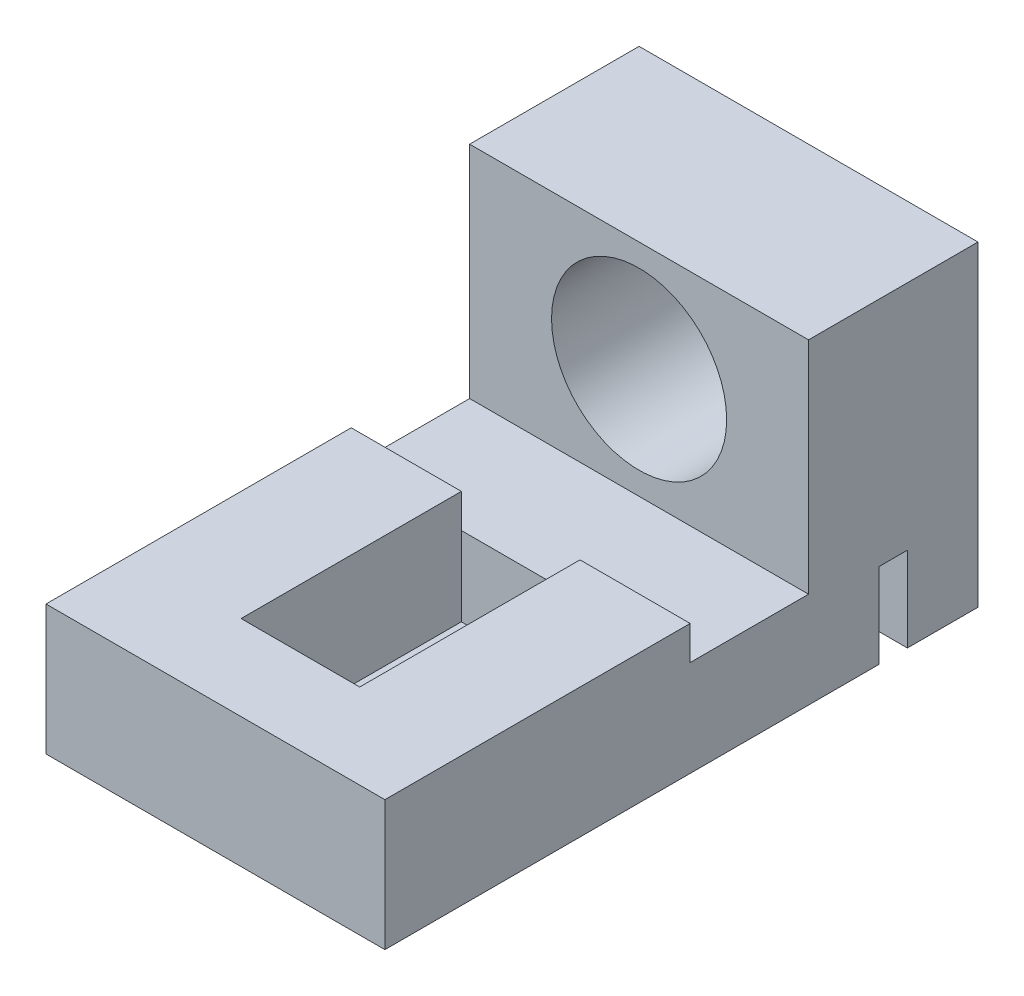
ISO-10303-21;
HEADER;
FILE_DESCRIPTION(('STEP AP214'),'2;1');
FILE_NAME('part.step','',(''),(''),'','','');
FILE_SCHEMA(('AUTOMOTIVE_DESIGN { 1 0 10303 214 1 1 1 1 }'));
ENDSEC;
DATA;
#1=APPLICATION_CONTEXT('core data for automotive mechanical design processes');
#2=APPLICATION_PROTOCOL_DEFINITION('international standard','automotive_design',2000,#1);
#3=PRODUCT_CONTEXT('',#1,'mechanical');
#4=PRODUCT('Part','Part','',(#3));
#5=PRODUCT_RELATED_PRODUCT_CATEGORY('part','',(#4));
#6=PRODUCT_DEFINITION_FORMATION('','',#4);
#7=PRODUCT_DEFINITION_CONTEXT('part definition',#1,'design');
#8=PRODUCT_DEFINITION('design','',#6,#7);
#9=PRODUCT_DEFINITION_SHAPE('','',#8);
#10=(LENGTH_UNIT() NAMED_UNIT(*) SI_UNIT(.MILLI.,.METRE.));
#11=(NAMED_UNIT(*) PLANE_ANGLE_UNIT() SI_UNIT($,.RADIAN.));
#12=(NAMED_UNIT(*) SI_UNIT($,.STERADIAN.) SOLID_ANGLE_UNIT());
#13=UNCERTAINTY_MEASURE_WITH_UNIT(LENGTH_MEASURE(1.E-05),#10,'distance_accuracy_value','');
#14=(GEOMETRIC_REPRESENTATION_CONTEXT(3) GLOBAL_UNCERTAINTY_ASSIGNED_CONTEXT((#13)) GLOBAL_UNIT_ASSIGNED_CONTEXT((#10,
#11,#12)) REPRESENTATION_CONTEXT('',''));
#15=CARTESIAN_POINT('',(0.,0.,0.));
#16=DIRECTION('',(0.,0.,1.));
#17=DIRECTION('',(1.,0.,0.));
#18=AXIS2_PLACEMENT_3D('',#15,#16,#17);
#19=CARTESIAN_POINT('',(60.,0.,0.));
#20=DIRECTION('',(1.,0.,0.));
#21=DIRECTION('',(0.,0.,-1.));
#22=AXIS2_PLACEMENT_3D('',#19,#20,#21);
#23=PLANE('',#22);
#24=DIRECTION('',(0.,1.,0.));
#25=VECTOR('',#24,1.);
#26=CARTESIAN_POINT('',(60.,4.545603587232,15.));
#27=LINE('',#26,#25);
#28=CARTESIAN_POINT('',(60.,-34.454396412768,15.));
#29=VERTEX_POINT('',#28);
#30=CARTESIAN_POINT('',(60.,4.545603587232,15.));
#31=VERTEX_POINT('',#30);
#32=EDGE_CURVE('E217',#29,#31,#27,.T.);
#33=ORIENTED_EDGE('',*,*,#32,.F.);
#34=DIRECTION('',(0.,0.,1.));
#35=VECTOR('',#34,1.);
#36=CARTESIAN_POINT('',(60.,-34.454396412768,4.57508133052897));
#37=LINE('',#36,#35);
#38=CARTESIAN_POINT('',(60.,-34.454396412768,35.9642857142857));
#39=VERTEX_POINT('',#38);
#40=EDGE_CURVE('E249',#29,#39,#37,.T.);
#41=ORIENTED_EDGE('',*,*,#40,.T.);
#42=DIRECTION('',(0.,-1.,0.));
#43=VECTOR('',#42,1.);
#44=CARTESIAN_POINT('',(60.,-28.454396412768,35.9642857142857));
#45=LINE('',#44,#43);
#46=CARTESIAN_POINT('',(60.,-28.454396412768,35.9642857142857));
#47=VERTEX_POINT('',#46);
#48=EDGE_CURVE('E181',#47,#39,#45,.T.);
#49=ORIENTED_EDGE('',*,*,#48,.F.);
#50=DIRECTION('',(0.,0.,1.));
#51=VECTOR('',#50,1.);
#52=CARTESIAN_POINT('',(60.,-28.454396412768,0.));
#53=LINE('',#52,#51);
#54=CARTESIAN_POINT('',(60.,-28.454396412768,90.));
#55=VERTEX_POINT('',#54);
#56=EDGE_CURVE('E173',#47,#55,#53,.T.);
#57=ORIENTED_EDGE('',*,*,#56,.T.);
#58=DIRECTION('',(0.,-1.,0.));
#59=VECTOR('',#58,1.);
#60=CARTESIAN_POINT('',(60.,-34.454396412768,90.));
#61=LINE('',#60,#59);
#62=CARTESIAN_POINT('',(60.,-51.454396412768,90.));
#63=VERTEX_POINT('',#62);
#64=EDGE_CURVE('E157',#55,#63,#61,.T.);
#65=ORIENTED_EDGE('',*,*,#64,.T.);
#66=DIRECTION('',(0.,0.,-1.));
#67=VECTOR('',#66,1.);
#68=CARTESIAN_POINT('',(60.,-51.454396412768,25.));
#69=LINE('',#68,#67);
#70=CARTESIAN_POINT('',(60.,-51.454396412768,2.5));
#71=VERTEX_POINT('',#70);
#72=EDGE_CURVE('E278',#63,#71,#69,.T.);
#73=ORIENTED_EDGE('',*,*,#72,.T.);
#74=DIRECTION('',(0.,-1.,0.));
#75=VECTOR('',#74,1.);
#76=CARTESIAN_POINT('',(60.,-66.454396412768,2.5));
#77=LINE('',#76,#75);
#78=CARTESIAN_POINT('',(60.,-36.454396412768,2.5));
#79=VERTEX_POINT('',#78);
#80=EDGE_CURVE('E255',#79,#71,#77,.T.);
#81=ORIENTED_EDGE('',*,*,#80,.F.);
#82=DIRECTION('',(0.,0.,1.));
#83=VECTOR('',#82,1.);
#84=CARTESIAN_POINT('',(60.,-36.454396412768,-2.5));
#85=LINE('',#84,#83);
#86=CARTESIAN_POINT('',(60.,-36.454396412768,-2.5));
#87=VERTEX_POINT('',#86);
#88=EDGE_CURVE('E261',#87,#79,#85,.T.);
#89=ORIENTED_EDGE('',*,*,#88,.F.);
#90=DIRECTION('',(0.,1.,0.));
#91=VECTOR('',#90,1.);
#92=CARTESIAN_POINT('',(60.,-66.454396412768,-2.5));
#93=LINE('',#92,#91);
#94=CARTESIAN_POINT('',(60.,-51.454396412768,-2.5));
#95=VERTEX_POINT('',#94);
#96=EDGE_CURVE('E258',#95,#87,#93,.T.);
#97=ORIENTED_EDGE('',*,*,#96,.F.);
#98=CARTESIAN_POINT('',(60.,-51.454396412768,-15.));
#99=VERTEX_POINT('',#98);
#100=EDGE_CURVE('E281',#95,#99,#69,.T.);
#101=ORIENTED_EDGE('',*,*,#100,.T.);
#102=DIRECTION('',(0.,1.,0.));
#103=VECTOR('',#102,1.);
#104=CARTESIAN_POINT('',(60.,4.545603587232,-15.));
#105=LINE('',#104,#103);
#106=CARTESIAN_POINT('',(60.,4.545603587232,-15.));
#107=VERTEX_POINT('',#106);
#108=EDGE_CURVE('E225',#99,#107,#105,.T.);
#109=ORIENTED_EDGE('',*,*,#108,.T.);
#110=DIRECTION('',(0.,0.,1.));
#111=VECTOR('',#110,1.);
#112=CARTESIAN_POINT('',(60.,4.545603587232,15.));
#113=LINE('',#112,#111);
#114=EDGE_CURVE('E280',#107,#31,#113,.T.);
#115=ORIENTED_EDGE('',*,*,#114,.T.);
#116=EDGE_LOOP('',(#33,#41,#49,#57,#65,#73,#81,#89,#97,#101,#109,#115));
#117=FACE_BOUND('',#116,.T.);
#118=ADVANCED_FACE('F35',(#117),#23,.T.);
#119=CARTESIAN_POINT('',(0.,0.,0.));
#120=DIRECTION('',(1.,0.,0.));
#121=DIRECTION('',(0.,0.,-1.));
#122=AXIS2_PLACEMENT_3D('',#119,#120,#121);
#123=PLANE('',#122);
#124=DIRECTION('',(0.,-1.,0.));
#125=VECTOR('',#124,1.);
#126=CARTESIAN_POINT('',(0.,-34.454396412768,90.));
#127=LINE('',#126,#125);
#128=CARTESIAN_POINT('',(0.,-28.454396412768,90.));
#129=VERTEX_POINT('',#128);
#130=CARTESIAN_POINT('',(0.,-51.454396412768,90.));
#131=VERTEX_POINT('',#130);
#132=EDGE_CURVE('E166',#129,#131,#127,.T.);
#133=ORIENTED_EDGE('',*,*,#132,.F.);
#134=DIRECTION('',(0.,0.,-1.));
#135=VECTOR('',#134,1.);
#136=CARTESIAN_POINT('',(0.,-28.454396412768,0.));
#137=LINE('',#136,#135);
#138=CARTESIAN_POINT('',(0.,-28.454396412768,35.9642857142857));
#139=VERTEX_POINT('',#138);
#140=EDGE_CURVE('E177',#129,#139,#137,.T.);
#141=ORIENTED_EDGE('',*,*,#140,.T.);
#142=DIRECTION('',(0.,-1.,0.));
#143=VECTOR('',#142,1.);
#144=CARTESIAN_POINT('',(0.,-28.454396412768,35.9642857142857));
#145=LINE('',#144,#143);
#146=CARTESIAN_POINT('',(0.,-34.454396412768,35.9642857142857));
#147=VERTEX_POINT('',#146);
#148=EDGE_CURVE('E201',#139,#147,#145,.T.);
#149=ORIENTED_EDGE('',*,*,#148,.T.);
#150=DIRECTION('',(0.,0.,-1.));
#151=VECTOR('',#150,1.);
#152=CARTESIAN_POINT('',(0.,-34.454396412768,4.57508133052897));
#153=LINE('',#152,#151);
#154=CARTESIAN_POINT('',(0.,-34.454396412768,15.));
#155=VERTEX_POINT('',#154);
#156=EDGE_CURVE('E52',#147,#155,#153,.T.);
#157=ORIENTED_EDGE('',*,*,#156,.T.);
#158=DIRECTION('',(0.,-1.,0.));
#159=VECTOR('',#158,1.);
#160=CARTESIAN_POINT('',(0.,4.545603587232,15.));
#161=LINE('',#160,#159);
#162=CARTESIAN_POINT('',(0.,4.545603587232,15.));
#163=VERTEX_POINT('',#162);
#164=EDGE_CURVE('E204',#163,#155,#161,.T.);
#165=ORIENTED_EDGE('',*,*,#164,.F.);
#166=DIRECTION('',(0.,0.,1.));
#167=VECTOR('',#166,1.);
#168=CARTESIAN_POINT('',(0.,4.545603587232,15.));
#169=LINE('',#168,#167);
#170=CARTESIAN_POINT('',(0.,4.54560358723201,-15.));
#171=VERTEX_POINT('',#170);
#172=EDGE_CURVE('E287',#171,#163,#169,.T.);
#173=ORIENTED_EDGE('',*,*,#172,.F.);
#174=DIRECTION('',(0.,-1.,0.));
#175=VECTOR('',#174,1.);
#176=CARTESIAN_POINT('',(0.,4.545603587232,-15.));
#177=LINE('',#176,#175);
#178=CARTESIAN_POINT('',(0.,-51.454396412768,-15.));
#179=VERTEX_POINT('',#178);
#180=EDGE_CURVE('E219',#171,#179,#177,.T.);
#181=ORIENTED_EDGE('',*,*,#180,.T.);
#182=DIRECTION('',(0.,0.,-1.));
#183=VECTOR('',#182,1.);
#184=CARTESIAN_POINT('',(0.,-51.454396412768,25.));
#185=LINE('',#184,#183);
#186=CARTESIAN_POINT('',(0.,-51.454396412768,-2.5));
#187=VERTEX_POINT('',#186);
#188=EDGE_CURVE('E277',#187,#179,#185,.T.);
#189=ORIENTED_EDGE('',*,*,#188,.F.);
#190=DIRECTION('',(0.,-1.,0.));
#191=VECTOR('',#190,1.);
#192=CARTESIAN_POINT('',(0.,0.,-2.5));
#193=LINE('',#192,#191);
#194=CARTESIAN_POINT('',(0.,-36.454396412768,-2.5));
#195=VERTEX_POINT('',#194);
#196=EDGE_CURVE('E11',#195,#187,#193,.T.);
#197=ORIENTED_EDGE('',*,*,#196,.F.);
#198=DIRECTION('',(0.,0.,1.));
#199=VECTOR('',#198,1.);
#200=CARTESIAN_POINT('',(0.,-36.454396412768,-2.5));
#201=LINE('',#200,#199);
#202=CARTESIAN_POINT('',(0.,-36.454396412768,2.5));
#203=VERTEX_POINT('',#202);
#204=EDGE_CURVE('E259',#195,#203,#201,.T.);
#205=ORIENTED_EDGE('',*,*,#204,.T.);
#206=DIRECTION('',(0.,-1.,0.));
#207=VECTOR('',#206,1.);
#208=CARTESIAN_POINT('',(0.,-66.454396412768,2.5));
#209=LINE('',#208,#207);
#210=CARTESIAN_POINT('',(0.,-51.454396412768,2.5));
#211=VERTEX_POINT('',#210);
#212=EDGE_CURVE('E253',#203,#211,#209,.T.);
#213=ORIENTED_EDGE('',*,*,#212,.T.);
#214=EDGE_CURVE('E285',#131,#211,#185,.T.);
#215=ORIENTED_EDGE('',*,*,#214,.F.);
#216=EDGE_LOOP('',(#133,#141,#149,#157,#165,#173,#181,#189,#197,#205,#213,#215));
#217=FACE_BOUND('',#216,.T.);
#218=ADVANCED_FACE('F315',(#217),#123,.F.);
#219=CARTESIAN_POINT('',(30.,-14.954396412768,-29.));
#220=DIRECTION('',(0.,0.,1.));
#221=DIRECTION('',(1.,0.,0.));
#222=AXIS2_PLACEMENT_3D('',#219,#220,#221);
#223=CYLINDRICAL_SURFACE('',#222,15.5);
#224=CARTESIAN_POINT('',(30.,-14.954396412768,-15.));
#225=DIRECTION('',(0.,0.,1.));
#226=DIRECTION('',(1.,0.,0.));
#227=AXIS2_PLACEMENT_3D('',#224,#225,#226);
#228=CIRCLE('',#227,15.5);
#229=CARTESIAN_POINT('',(45.5,-14.954396412768,-15.));
#230=VERTEX_POINT('',#229);
#231=EDGE_CURVE('E228',#230,#230,#228,.F.);
#232=ORIENTED_EDGE('',*,*,#231,.T.);
#233=EDGE_LOOP('',(#232));
#234=FACE_BOUND('',#233,.T.);
#235=CARTESIAN_POINT('',(30.,-14.954396412768,15.));
#236=DIRECTION('',(0.,0.,1.));
#237=DIRECTION('',(1.,0.,0.));
#238=AXIS2_PLACEMENT_3D('',#235,#236,#237);
#239=CIRCLE('',#238,15.5);
#240=CARTESIAN_POINT('',(45.5,-14.954396412768,15.));
#241=VERTEX_POINT('',#240);
#242=EDGE_CURVE('E39',#241,#241,#239,.F.);
#243=ORIENTED_EDGE('',*,*,#242,.F.);
#244=EDGE_LOOP('',(#243));
#245=FACE_BOUND('',#244,.T.);
#246=ADVANCED_FACE('F295',(#234,#245),#223,.F.);
#247=CARTESIAN_POINT('',(0.,-34.454396412768,0.));
#248=DIRECTION('',(0.,-1.,0.));
#249=DIRECTION('',(0.,0.,-1.));
#250=AXIS2_PLACEMENT_3D('',#247,#248,#249);
#251=PLANE('',#250);
#252=DIRECTION('',(1.,0.,0.));
#253=VECTOR('',#252,1.);
#254=CARTESIAN_POINT('',(0.,-34.454396412768,35.9642857142857));
#255=LINE('',#254,#253);
#256=CARTESIAN_POINT('',(19.5,-34.454396412768,35.9642857142857));
#257=VERTEX_POINT('',#256);
#258=CARTESIAN_POINT('',(40.5,-34.454396412768,35.9642857142857));
#259=VERTEX_POINT('',#258);
#260=EDGE_CURVE('E233',#257,#259,#255,.T.);
#261=ORIENTED_EDGE('',*,*,#260,.T.);
#262=DIRECTION('',(1.,0.,0.));
#263=VECTOR('',#262,1.);
#264=CARTESIAN_POINT('',(0.,-34.454396412768,35.9642857142857));
#265=LINE('',#264,#263);
#266=EDGE_CURVE('E59',#259,#39,#265,.T.);
#267=ORIENTED_EDGE('',*,*,#266,.T.);
#268=ORIENTED_EDGE('',*,*,#40,.F.);
#269=DIRECTION('',(1.,0.,0.));
#270=VECTOR('',#269,1.);
#271=CARTESIAN_POINT('',(0.,-34.454396412768,15.));
#272=LINE('',#271,#270);
#273=EDGE_CURVE('E214',#155,#29,#272,.T.);
#274=ORIENTED_EDGE('',*,*,#273,.F.);
#275=ORIENTED_EDGE('',*,*,#156,.F.);
#276=DIRECTION('',(1.,0.,0.));
#277=VECTOR('',#276,1.);
#278=CARTESIAN_POINT('',(0.,-34.454396412768,35.9642857142857));
#279=LINE('',#278,#277);
#280=EDGE_CURVE('E183',#147,#257,#279,.T.);
#281=ORIENTED_EDGE('',*,*,#280,.T.);
#282=EDGE_LOOP('',(#261,#267,#268,#274,#275,#281));
#283=FACE_BOUND('',#282,.T.);
#284=ADVANCED_FACE('F361',(#283),#251,.F.);
#285=CARTESIAN_POINT('',(60.,-51.454396412768,25.));
#286=DIRECTION('',(0.,1.,0.));
#287=DIRECTION('',(0.,0.,1.));
#288=AXIS2_PLACEMENT_3D('',#285,#286,#287);
#289=PLANE('',#288);
#290=DIRECTION('',(-1.,0.,0.));
#291=VECTOR('',#290,1.);
#292=CARTESIAN_POINT('',(60.,-51.454396412768,2.5));
#293=LINE('',#292,#291);
#294=EDGE_CURVE('E274',#71,#211,#293,.T.);
#295=ORIENTED_EDGE('',*,*,#294,.F.);
#296=ORIENTED_EDGE('',*,*,#72,.F.);
#297=DIRECTION('',(-1.,0.,0.));
#298=VECTOR('',#297,1.);
#299=CARTESIAN_POINT('',(60.,-51.454396412768,90.));
#300=LINE('',#299,#298);
#301=EDGE_CURVE('E163',#63,#131,#300,.T.);
#302=ORIENTED_EDGE('',*,*,#301,.T.);
#303=ORIENTED_EDGE('',*,*,#214,.T.);
#304=EDGE_LOOP('',(#295,#296,#302,#303));
#305=FACE_BOUND('',#304,.T.);
#306=ADVANCED_FACE('F37',(#305),#289,.F.);
#307=ORIENTED_EDGE('',*,*,#188,.T.);
#308=DIRECTION('',(1.,0.,0.));
#309=VECTOR('',#308,1.);
#310=CARTESIAN_POINT('',(0.,-51.454396412768,-15.));
#311=LINE('',#310,#309);
#312=EDGE_CURVE('E222',#179,#99,#311,.T.);
#313=ORIENTED_EDGE('',*,*,#312,.T.);
#314=ORIENTED_EDGE('',*,*,#100,.F.);
#315=DIRECTION('',(1.,0.,0.));
#316=VECTOR('',#315,1.);
#317=CARTESIAN_POINT('',(60.,-51.454396412768,-2.5));
#318=LINE('',#317,#316);
#319=EDGE_CURVE('E272',#187,#95,#318,.T.);
#320=ORIENTED_EDGE('',*,*,#319,.F.);
#321=EDGE_LOOP('',(#307,#313,#314,#320));
#322=FACE_BOUND('',#321,.T.);
#323=ADVANCED_FACE('F327',(#322),#289,.F.);
#324=CARTESIAN_POINT('',(60.,4.545603587232,15.));
#325=DIRECTION('',(0.,-1.,0.));
#326=DIRECTION('',(0.,0.,-1.));
#327=AXIS2_PLACEMENT_3D('',#324,#325,#326);
#328=PLANE('',#327);
#329=ORIENTED_EDGE('',*,*,#172,.T.);
#330=DIRECTION('',(-1.,0.,0.));
#331=VECTOR('',#330,1.);
#332=CARTESIAN_POINT('',(60.,4.545603587232,15.));
#333=LINE('',#332,#331);
#334=EDGE_CURVE('E284',#31,#163,#333,.T.);
#335=ORIENTED_EDGE('',*,*,#334,.F.);
#336=ORIENTED_EDGE('',*,*,#114,.F.);
#337=DIRECTION('',(-1.,0.,0.));
#338=VECTOR('',#337,1.);
#339=CARTESIAN_POINT('',(60.,4.54560358723201,-15.));
#340=LINE('',#339,#338);
#341=EDGE_CURVE('E44',#107,#171,#340,.T.);
#342=ORIENTED_EDGE('',*,*,#341,.T.);
#343=EDGE_LOOP('',(#329,#335,#336,#342));
#344=FACE_BOUND('',#343,.T.);
#345=ADVANCED_FACE('F324',(#344),#328,.F.);
#346=CARTESIAN_POINT('',(60.,-66.454396412768,2.5));
#347=DIRECTION('',(0.,0.,-1.));
#348=DIRECTION('',(-1.,0.,0.));
#349=AXIS2_PLACEMENT_3D('',#346,#347,#348);
#350=PLANE('',#349);
#351=ORIENTED_EDGE('',*,*,#294,.T.);
#352=ORIENTED_EDGE('',*,*,#212,.F.);
#353=DIRECTION('',(-1.,0.,0.));
#354=VECTOR('',#353,1.);
#355=CARTESIAN_POINT('',(60.,-36.454396412768,2.5));
#356=LINE('',#355,#354);
#357=EDGE_CURVE('E263',#79,#203,#356,.T.);
#358=ORIENTED_EDGE('',*,*,#357,.F.);
#359=ORIENTED_EDGE('',*,*,#80,.T.);
#360=EDGE_LOOP('',(#351,#352,#358,#359));
#361=FACE_BOUND('',#360,.T.);
#362=ADVANCED_FACE('F326',(#361),#350,.T.);
#363=CARTESIAN_POINT('',(60.,-66.454396412768,-2.5));
#364=DIRECTION('',(0.,0.,1.));
#365=DIRECTION('',(1.,0.,0.));
#366=AXIS2_PLACEMENT_3D('',#363,#364,#365);
#367=PLANE('',#366);
#368=ORIENTED_EDGE('',*,*,#319,.T.);
#369=ORIENTED_EDGE('',*,*,#96,.T.);
#370=DIRECTION('',(-1.,0.,0.));
#371=VECTOR('',#370,1.);
#372=CARTESIAN_POINT('',(60.,-36.454396412768,-2.5));
#373=LINE('',#372,#371);
#374=EDGE_CURVE('E270',#87,#195,#373,.T.);
#375=ORIENTED_EDGE('',*,*,#374,.T.);
#376=ORIENTED_EDGE('',*,*,#196,.T.);
#377=EDGE_LOOP('',(#368,#369,#375,#376));
#378=FACE_BOUND('',#377,.T.);
#379=ADVANCED_FACE('F333',(#378),#367,.T.);
#380=CARTESIAN_POINT('',(60.,-36.454396412768,-2.5));
#381=DIRECTION('',(0.,-1.,0.));
#382=DIRECTION('',(0.,0.,-1.));
#383=AXIS2_PLACEMENT_3D('',#380,#381,#382);
#384=PLANE('',#383);
#385=ORIENTED_EDGE('',*,*,#204,.F.);
#386=ORIENTED_EDGE('',*,*,#374,.F.);
#387=ORIENTED_EDGE('',*,*,#88,.T.);
#388=ORIENTED_EDGE('',*,*,#357,.T.);
#389=EDGE_LOOP('',(#385,#386,#387,#388));
#390=FACE_BOUND('',#389,.T.);
#391=ADVANCED_FACE('F353',(#390),#384,.T.);
#392=CARTESIAN_POINT('',(60.,-34.454396412768,90.));
#393=DIRECTION('',(0.,0.,1.));
#394=DIRECTION('',(0.,-1.,0.));
#395=AXIS2_PLACEMENT_3D('',#392,#393,#394);
#396=PLANE('',#395);
#397=ORIENTED_EDGE('',*,*,#301,.F.);
#398=ORIENTED_EDGE('',*,*,#64,.F.);
#399=DIRECTION('',(-1.,0.,0.));
#400=VECTOR('',#399,1.);
#401=CARTESIAN_POINT('',(0.,-28.454396412768,90.));
#402=LINE('',#401,#400);
#403=EDGE_CURVE('E161',#55,#129,#402,.T.);
#404=ORIENTED_EDGE('',*,*,#403,.T.);
#405=ORIENTED_EDGE('',*,*,#132,.T.);
#406=EDGE_LOOP('',(#397,#398,#404,#405));
#407=FACE_BOUND('',#406,.T.);
#408=ADVANCED_FACE('F159',(#407),#396,.T.);
#409=CARTESIAN_POINT('',(40.5,-48.454396412768,0.));
#410=DIRECTION('',(-1.,0.,0.));
#411=DIRECTION('',(0.,0.,1.));
#412=AXIS2_PLACEMENT_3D('',#409,#410,#411);
#413=PLANE('',#412);
#414=DIRECTION('',(0.,1.,0.));
#415=VECTOR('',#414,1.);
#416=CARTESIAN_POINT('',(40.5,-48.454396412768,74.9642857142857));
#417=LINE('',#416,#415);
#418=CARTESIAN_POINT('',(40.5,-48.454396412768,74.9642857142857));
#419=VERTEX_POINT('',#418);
#420=CARTESIAN_POINT('',(40.5,-28.454396412768,74.9642857142857));
#421=VERTEX_POINT('',#420);
#422=EDGE_CURVE('E247',#419,#421,#417,.T.);
#423=ORIENTED_EDGE('',*,*,#422,.T.);
#424=DIRECTION('',(0.,0.,-1.));
#425=VECTOR('',#424,1.);
#426=CARTESIAN_POINT('',(40.5,-28.454396412768,0.));
#427=LINE('',#426,#425);
#428=CARTESIAN_POINT('',(40.5,-28.454396412768,35.9642857142857));
#429=VERTEX_POINT('',#428);
#430=EDGE_CURVE('E196',#421,#429,#427,.T.);
#431=ORIENTED_EDGE('',*,*,#430,.T.);
#432=DIRECTION('',(0.,-1.,0.));
#433=VECTOR('',#432,1.);
#434=CARTESIAN_POINT('',(40.5,-28.454396412768,35.9642857142857));
#435=LINE('',#434,#433);
#436=EDGE_CURVE('E205',#429,#259,#435,.T.);
#437=ORIENTED_EDGE('',*,*,#436,.T.);
#438=DIRECTION('',(0.,1.,0.));
#439=VECTOR('',#438,1.);
#440=CARTESIAN_POINT('',(40.5,-48.454396412768,35.9642857142857));
#441=LINE('',#440,#439);
#442=CARTESIAN_POINT('',(40.5,-48.454396412768,35.9642857142857));
#443=VERTEX_POINT('',#442);
#444=EDGE_CURVE('E239',#443,#259,#441,.T.);
#445=ORIENTED_EDGE('',*,*,#444,.F.);
#446=DIRECTION('',(0.,0.,1.));
#447=VECTOR('',#446,1.);
#448=CARTESIAN_POINT('',(40.5,-48.454396412768,0.));
#449=LINE('',#448,#447);
#450=EDGE_CURVE('E229',#443,#419,#449,.T.);
#451=ORIENTED_EDGE('',*,*,#450,.T.);
#452=EDGE_LOOP('',(#423,#431,#437,#445,#451));
#453=FACE_BOUND('',#452,.T.);
#454=ADVANCED_FACE('F366',(#453),#413,.T.);
#455=CARTESIAN_POINT('',(0.,-48.454396412768,74.9642857142857));
#456=DIRECTION('',(0.,0.,-1.));
#457=DIRECTION('',(-1.,0.,0.));
#458=AXIS2_PLACEMENT_3D('',#455,#456,#457);
#459=PLANE('',#458);
#460=DIRECTION('',(0.,1.,0.));
#461=VECTOR('',#460,1.);
#462=CARTESIAN_POINT('',(19.5,-48.454396412768,74.9642857142857));
#463=LINE('',#462,#461);
#464=CARTESIAN_POINT('',(19.5,-48.454396412768,74.9642857142857));
#465=VERTEX_POINT('',#464);
#466=CARTESIAN_POINT('',(19.5,-28.454396412768,74.9642857142857));
#467=VERTEX_POINT('',#466);
#468=EDGE_CURVE('E245',#465,#467,#463,.T.);
#469=ORIENTED_EDGE('',*,*,#468,.T.);
#470=DIRECTION('',(1.,0.,0.));
#471=VECTOR('',#470,1.);
#472=CARTESIAN_POINT('',(0.,-28.454396412768,74.9642857142857));
#473=LINE('',#472,#471);
#474=EDGE_CURVE('E193',#467,#421,#473,.T.);
#475=ORIENTED_EDGE('',*,*,#474,.T.);
#476=ORIENTED_EDGE('',*,*,#422,.F.);
#477=DIRECTION('',(-1.,0.,0.));
#478=VECTOR('',#477,1.);
#479=CARTESIAN_POINT('',(0.,-48.454396412768,74.9642857142857));
#480=LINE('',#479,#478);
#481=EDGE_CURVE('E232',#419,#465,#480,.T.);
#482=ORIENTED_EDGE('',*,*,#481,.T.);
#483=EDGE_LOOP('',(#469,#475,#476,#482));
#484=FACE_BOUND('',#483,.T.);
#485=ADVANCED_FACE('F374',(#484),#459,.T.);
#486=CARTESIAN_POINT('',(19.5,-48.454396412768,0.));
#487=DIRECTION('',(1.,0.,0.));
#488=DIRECTION('',(0.,0.,-1.));
#489=AXIS2_PLACEMENT_3D('',#486,#487,#488);
#490=PLANE('',#489);
#491=DIRECTION('',(0.,1.,0.));
#492=VECTOR('',#491,1.);
#493=CARTESIAN_POINT('',(19.5,-48.454396412768,35.9642857142857));
#494=LINE('',#493,#492);
#495=CARTESIAN_POINT('',(19.5,-48.454396412768,35.9642857142857));
#496=VERTEX_POINT('',#495);
#497=EDGE_CURVE('E242',#496,#257,#494,.T.);
#498=ORIENTED_EDGE('',*,*,#497,.T.);
#499=DIRECTION('',(0.,-1.,0.));
#500=VECTOR('',#499,1.);
#501=CARTESIAN_POINT('',(19.5,-28.454396412768,35.9642857142857));
#502=LINE('',#501,#500);
#503=CARTESIAN_POINT('',(19.5,-28.454396412768,35.9642857142857));
#504=VERTEX_POINT('',#503);
#505=EDGE_CURVE('E208',#504,#257,#502,.T.);
#506=ORIENTED_EDGE('',*,*,#505,.F.);
#507=DIRECTION('',(0.,0.,1.));
#508=VECTOR('',#507,1.);
#509=CARTESIAN_POINT('',(19.5,-28.454396412768,0.));
#510=LINE('',#509,#508);
#511=EDGE_CURVE('E190',#504,#467,#510,.T.);
#512=ORIENTED_EDGE('',*,*,#511,.T.);
#513=ORIENTED_EDGE('',*,*,#468,.F.);
#514=DIRECTION('',(0.,0.,-1.));
#515=VECTOR('',#514,1.);
#516=CARTESIAN_POINT('',(19.5,-48.454396412768,0.));
#517=LINE('',#516,#515);
#518=EDGE_CURVE('E235',#465,#496,#517,.T.);
#519=ORIENTED_EDGE('',*,*,#518,.T.);
#520=EDGE_LOOP('',(#498,#506,#512,#513,#519));
#521=FACE_BOUND('',#520,.T.);
#522=ADVANCED_FACE('F378',(#521),#490,.T.);
#523=CARTESIAN_POINT('',(0.,-48.454396412768,35.9642857142857));
#524=DIRECTION('',(0.,0.,1.));
#525=DIRECTION('',(1.,0.,0.));
#526=AXIS2_PLACEMENT_3D('',#523,#524,#525);
#527=PLANE('',#526);
#528=ORIENTED_EDGE('',*,*,#260,.F.);
#529=ORIENTED_EDGE('',*,*,#497,.F.);
#530=DIRECTION('',(1.,0.,0.));
#531=VECTOR('',#530,1.);
#532=CARTESIAN_POINT('',(0.,-48.454396412768,35.9642857142857));
#533=LINE('',#532,#531);
#534=EDGE_CURVE('E237',#496,#443,#533,.T.);
#535=ORIENTED_EDGE('',*,*,#534,.T.);
#536=ORIENTED_EDGE('',*,*,#444,.T.);
#537=EDGE_LOOP('',(#528,#529,#535,#536));
#538=FACE_BOUND('',#537,.T.);
#539=ADVANCED_FACE('F311',(#538),#527,.T.);
#540=CARTESIAN_POINT('',(0.,-48.454396412768,0.));
#541=DIRECTION('',(0.,-1.,0.));
#542=DIRECTION('',(0.,0.,-1.));
#543=AXIS2_PLACEMENT_3D('',#540,#541,#542);
#544=PLANE('',#543);
#545=ORIENTED_EDGE('',*,*,#450,.F.);
#546=ORIENTED_EDGE('',*,*,#534,.F.);
#547=ORIENTED_EDGE('',*,*,#518,.F.);
#548=ORIENTED_EDGE('',*,*,#481,.F.);
#549=EDGE_LOOP('',(#545,#546,#547,#548));
#550=FACE_BOUND('',#549,.T.);
#551=ADVANCED_FACE('F301',(#550),#544,.F.);
#552=CARTESIAN_POINT('',(0.,0.,-15.));
#553=DIRECTION('',(0.,0.,1.));
#554=DIRECTION('',(1.,0.,0.));
#555=AXIS2_PLACEMENT_3D('',#552,#553,#554);
#556=PLANE('',#555);
#557=ORIENTED_EDGE('',*,*,#180,.F.);
#558=ORIENTED_EDGE('',*,*,#341,.F.);
#559=ORIENTED_EDGE('',*,*,#108,.F.);
#560=ORIENTED_EDGE('',*,*,#312,.F.);
#561=EDGE_LOOP('',(#557,#558,#559,#560));
#562=FACE_BOUND('',#561,.T.);
#563=ORIENTED_EDGE('',*,*,#231,.F.);
#564=EDGE_LOOP('',(#563));
#565=FACE_BOUND('',#564,.T.);
#566=ADVANCED_FACE('F298',(#562,#565),#556,.F.);
#567=CARTESIAN_POINT('',(0.,0.,15.));
#568=DIRECTION('',(0.,0.,1.));
#569=DIRECTION('',(1.,0.,0.));
#570=AXIS2_PLACEMENT_3D('',#567,#568,#569);
#571=PLANE('',#570);
#572=ORIENTED_EDGE('',*,*,#164,.T.);
#573=ORIENTED_EDGE('',*,*,#273,.T.);
#574=ORIENTED_EDGE('',*,*,#32,.T.);
#575=ORIENTED_EDGE('',*,*,#334,.T.);
#576=EDGE_LOOP('',(#572,#573,#574,#575));
#577=FACE_BOUND('',#576,.T.);
#578=ORIENTED_EDGE('',*,*,#242,.T.);
#579=EDGE_LOOP('',(#578));
#580=FACE_BOUND('',#579,.T.);
#581=ADVANCED_FACE('F300',(#577,#580),#571,.T.);
#582=CARTESIAN_POINT('',(0.,-28.454396412768,35.9642857142857));
#583=DIRECTION('',(0.,0.,-1.));
#584=DIRECTION('',(-1.,0.,0.));
#585=AXIS2_PLACEMENT_3D('',#582,#583,#584);
#586=PLANE('',#585);
#587=ORIENTED_EDGE('',*,*,#266,.F.);
#588=ORIENTED_EDGE('',*,*,#436,.F.);
#589=DIRECTION('',(1.,0.,0.));
#590=VECTOR('',#589,1.);
#591=CARTESIAN_POINT('',(0.,-28.454396412768,35.9642857142857));
#592=LINE('',#591,#590);
#593=EDGE_CURVE('E199',#429,#47,#592,.T.);
#594=ORIENTED_EDGE('',*,*,#593,.T.);
#595=ORIENTED_EDGE('',*,*,#48,.T.);
#596=EDGE_LOOP('',(#587,#588,#594,#595));
#597=FACE_BOUND('',#596,.T.);
#598=ADVANCED_FACE('F308',(#597),#586,.T.);
#599=CARTESIAN_POINT('',(0.,-28.454396412768,35.9642857142857));
#600=DIRECTION('',(0.,0.,-1.));
#601=DIRECTION('',(-1.,0.,0.));
#602=AXIS2_PLACEMENT_3D('',#599,#600,#601);
#603=PLANE('',#602);
#604=ORIENTED_EDGE('',*,*,#280,.F.);
#605=ORIENTED_EDGE('',*,*,#148,.F.);
#606=DIRECTION('',(1.,0.,0.));
#607=VECTOR('',#606,1.);
#608=CARTESIAN_POINT('',(0.,-28.454396412768,35.9642857142857));
#609=LINE('',#608,#607);
#610=EDGE_CURVE('E187',#139,#504,#609,.T.);
#611=ORIENTED_EDGE('',*,*,#610,.T.);
#612=ORIENTED_EDGE('',*,*,#505,.T.);
#613=EDGE_LOOP('',(#604,#605,#611,#612));
#614=FACE_BOUND('',#613,.T.);
#615=ADVANCED_FACE('F360',(#614),#603,.T.);
#616=CARTESIAN_POINT('',(0.,-28.454396412768,0.));
#617=DIRECTION('',(0.,-1.,0.));
#618=DIRECTION('',(0.,0.,-1.));
#619=AXIS2_PLACEMENT_3D('',#616,#617,#618);
#620=PLANE('',#619);
#621=ORIENTED_EDGE('',*,*,#56,.F.);
#622=ORIENTED_EDGE('',*,*,#593,.F.);
#623=ORIENTED_EDGE('',*,*,#430,.F.);
#624=ORIENTED_EDGE('',*,*,#474,.F.);
#625=ORIENTED_EDGE('',*,*,#511,.F.);
#626=ORIENTED_EDGE('',*,*,#610,.F.);
#627=ORIENTED_EDGE('',*,*,#140,.F.);
#628=ORIENTED_EDGE('',*,*,#403,.F.);
#629=EDGE_LOOP('',(#621,#622,#623,#624,#625,#626,#627,#628));
#630=FACE_BOUND('',#629,.T.);
#631=ADVANCED_FACE('F171',(#630),#620,.F.);
#632=CLOSED_SHELL('',(#118,#218,#246,#284,#306,#323,#345,#362,#379,#391,#408,#454,#485,#522,
#539,#551,#566,#581,#598,#615,#631));
#633=MANIFOLD_SOLID_BREP('B2',#632);
#634=ADVANCED_BREP_SHAPE_REPRESENTATION('',(#18,#633),#14);
#635=SHAPE_DEFINITION_REPRESENTATION(#9,#634);
ENDSEC;
END-ISO-10303-21;
